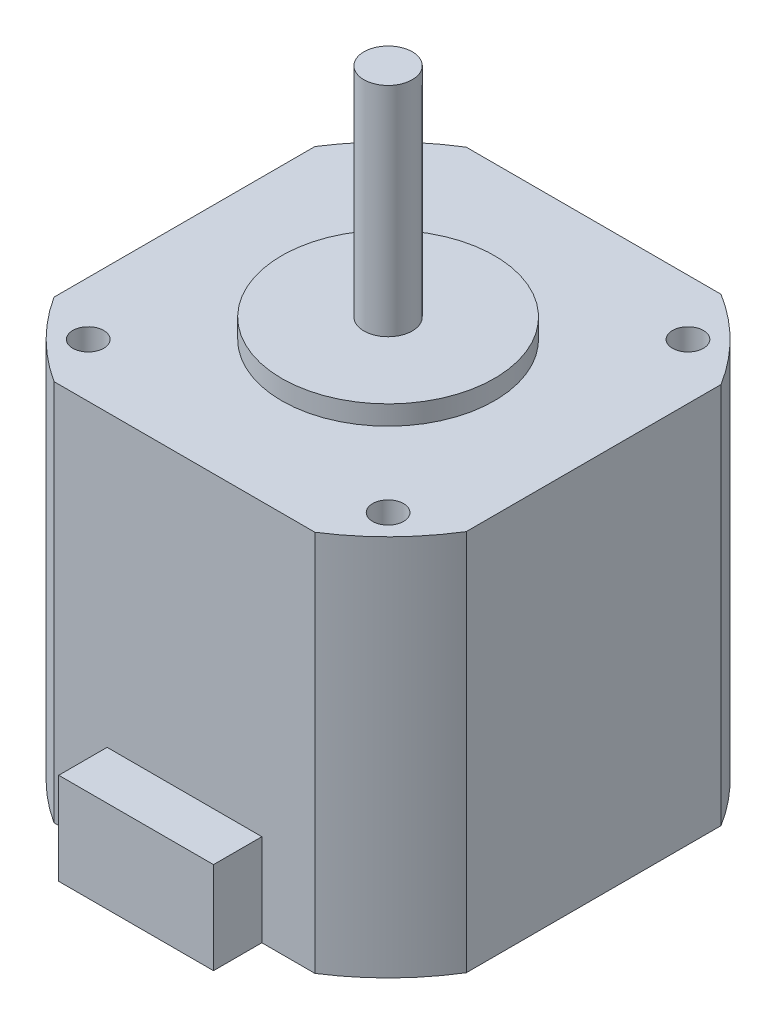
ISO-10303-21;
HEADER;
FILE_DESCRIPTION(('STEP AP214'),'2;1');
FILE_NAME('part.step','',(''),(''),'','','');
FILE_SCHEMA(('AUTOMOTIVE_DESIGN { 1 0 10303 214 1 1 1 1 }'));
ENDSEC;
DATA;
#1=APPLICATION_CONTEXT('core data for automotive mechanical design processes');
#2=APPLICATION_PROTOCOL_DEFINITION('international standard','automotive_design',2000,#1);
#3=PRODUCT_CONTEXT('',#1,'mechanical');
#4=PRODUCT('Part','Part','',(#3));
#5=PRODUCT_RELATED_PRODUCT_CATEGORY('part','',(#4));
#6=PRODUCT_DEFINITION_FORMATION('','',#4);
#7=PRODUCT_DEFINITION_CONTEXT('part definition',#1,'design');
#8=PRODUCT_DEFINITION('design','',#6,#7);
#9=PRODUCT_DEFINITION_SHAPE('','',#8);
#10=(LENGTH_UNIT() NAMED_UNIT(*) SI_UNIT(.MILLI.,.METRE.));
#11=(NAMED_UNIT(*) PLANE_ANGLE_UNIT() SI_UNIT($,.RADIAN.));
#12=(NAMED_UNIT(*) SI_UNIT($,.STERADIAN.) SOLID_ANGLE_UNIT());
#13=UNCERTAINTY_MEASURE_WITH_UNIT(LENGTH_MEASURE(1.E-05),#10,'distance_accuracy_value','');
#14=(GEOMETRIC_REPRESENTATION_CONTEXT(3) GLOBAL_UNCERTAINTY_ASSIGNED_CONTEXT((#13)) GLOBAL_UNIT_ASSIGNED_CONTEXT((#10,
#11,#12)) REPRESENTATION_CONTEXT('',''));
#15=CARTESIAN_POINT('',(0.,0.,0.));
#16=DIRECTION('',(0.,0.,1.));
#17=DIRECTION('',(1.,0.,0.));
#18=AXIS2_PLACEMENT_3D('',#15,#16,#17);
#19=CARTESIAN_POINT('',(0.,39.5,0.));
#20=DIRECTION('',(0.,0.,-1.));
#21=DIRECTION('',(-1.,0.,0.));
#22=AXIS2_PLACEMENT_3D('',#19,#20,#21);
#23=PLANE('',#22);
#24=DIRECTION('',(0.,-1.,0.));
#25=VECTOR('',#24,1.);
#26=CARTESIAN_POINT('',(13.05,9.5,0.));
#27=LINE('',#26,#25);
#28=CARTESIAN_POINT('',(13.05,9.5,0.));
#29=VERTEX_POINT('',#28);
#30=CARTESIAN_POINT('',(13.05,0.,0.));
#31=VERTEX_POINT('',#30);
#32=EDGE_CURVE('E252',#29,#31,#27,.T.);
#33=ORIENTED_EDGE('',*,*,#32,.F.);
#34=DIRECTION('',(-1.,0.,0.));
#35=VECTOR('',#34,1.);
#36=CARTESIAN_POINT('',(13.05,9.5,0.));
#37=LINE('',#36,#35);
#38=CARTESIAN_POINT('',(29.05,9.5,0.));
#39=VERTEX_POINT('',#38);
#40=EDGE_CURVE('E255',#39,#29,#37,.T.);
#41=ORIENTED_EDGE('',*,*,#40,.F.);
#42=DIRECTION('',(0.,-1.,0.));
#43=VECTOR('',#42,1.);
#44=CARTESIAN_POINT('',(29.05,9.5,0.));
#45=LINE('',#44,#43);
#46=CARTESIAN_POINT('',(29.05,0.,0.));
#47=VERTEX_POINT('',#46);
#48=EDGE_CURVE('E262',#39,#47,#45,.T.);
#49=ORIENTED_EDGE('',*,*,#48,.T.);
#50=DIRECTION('',(1.,0.,0.));
#51=VECTOR('',#50,1.);
#52=CARTESIAN_POINT('',(0.,0.,0.));
#53=LINE('',#52,#51);
#54=CARTESIAN_POINT('',(34.5369381254605,0.,0.));
#55=VERTEX_POINT('',#54);
#56=EDGE_CURVE('E169',#47,#55,#53,.T.);
#57=ORIENTED_EDGE('',*,*,#56,.T.);
#58=DIRECTION('',(0.,-1.,0.));
#59=VECTOR('',#58,1.);
#60=CARTESIAN_POINT('',(34.5369381254605,39.5,0.));
#61=LINE('',#60,#59);
#62=CARTESIAN_POINT('',(34.5369381254605,39.5,0.));
#63=VERTEX_POINT('',#62);
#64=EDGE_CURVE('E51',#63,#55,#61,.T.);
#65=ORIENTED_EDGE('',*,*,#64,.F.);
#66=DIRECTION('',(1.,0.,0.));
#67=VECTOR('',#66,1.);
#68=CARTESIAN_POINT('',(0.,39.5,0.));
#69=LINE('',#68,#67);
#70=CARTESIAN_POINT('',(7.5630618745395,39.5,0.));
#71=VERTEX_POINT('',#70);
#72=EDGE_CURVE('E211',#71,#63,#69,.T.);
#73=ORIENTED_EDGE('',*,*,#72,.F.);
#74=DIRECTION('',(0.,-1.,0.));
#75=VECTOR('',#74,1.);
#76=CARTESIAN_POINT('',(7.5630618745395,39.5,0.));
#77=LINE('',#76,#75);
#78=CARTESIAN_POINT('',(7.5630618745395,0.,0.));
#79=VERTEX_POINT('',#78);
#80=EDGE_CURVE('E160',#71,#79,#77,.T.);
#81=ORIENTED_EDGE('',*,*,#80,.T.);
#82=EDGE_CURVE('E164',#79,#31,#53,.T.);
#83=ORIENTED_EDGE('',*,*,#82,.T.);
#84=EDGE_LOOP('',(#33,#41,#49,#57,#65,#73,#81,#83));
#85=FACE_BOUND('',#84,.T.);
#86=ADVANCED_FACE('F48',(#85),#23,.F.);
#87=CARTESIAN_POINT('',(21.05,39.5,-21.05));
#88=DIRECTION('',(0.,-1.,0.));
#89=DIRECTION('',(0.,0.,-1.));
#90=AXIS2_PLACEMENT_3D('',#87,#88,#89);
#91=CYLINDRICAL_SURFACE('',#90,25.);
#92=CARTESIAN_POINT('',(21.05,0.,-21.05));
#93=DIRECTION('',(0.,1.,0.));
#94=DIRECTION('',(0.,0.,1.));
#95=AXIS2_PLACEMENT_3D('',#92,#93,#94);
#96=CIRCLE('',#95,25.);
#97=CARTESIAN_POINT('',(42.3,0.,-7.88043280893409));
#98=VERTEX_POINT('',#97);
#99=EDGE_CURVE('E168',#55,#98,#96,.T.);
#100=ORIENTED_EDGE('',*,*,#99,.T.);
#101=DIRECTION('',(0.,-1.,0.));
#102=VECTOR('',#101,1.);
#103=CARTESIAN_POINT('',(42.3,39.5,-7.88043280893409));
#104=LINE('',#103,#102);
#105=CARTESIAN_POINT('',(42.3,39.5,-7.88043280893409));
#106=VERTEX_POINT('',#105);
#107=EDGE_CURVE('E195',#106,#98,#104,.T.);
#108=ORIENTED_EDGE('',*,*,#107,.F.);
#109=CARTESIAN_POINT('',(21.05,39.5,-21.05));
#110=DIRECTION('',(0.,1.,0.));
#111=DIRECTION('',(0.,0.,1.));
#112=AXIS2_PLACEMENT_3D('',#109,#110,#111);
#113=CIRCLE('',#112,25.);
#114=EDGE_CURVE('E116',#63,#106,#113,.T.);
#115=ORIENTED_EDGE('',*,*,#114,.F.);
#116=ORIENTED_EDGE('',*,*,#64,.T.);
#117=EDGE_LOOP('',(#100,#108,#115,#116));
#118=FACE_BOUND('',#117,.T.);
#119=ADVANCED_FACE('F238',(#118),#91,.T.);
#120=CARTESIAN_POINT('',(42.3,39.5,0.));
#121=DIRECTION('',(-1.,0.,0.));
#122=DIRECTION('',(0.,0.,1.));
#123=AXIS2_PLACEMENT_3D('',#120,#121,#122);
#124=PLANE('',#123);
#125=DIRECTION('',(0.,0.,-1.));
#126=VECTOR('',#125,1.);
#127=CARTESIAN_POINT('',(42.3,0.,0.));
#128=LINE('',#127,#126);
#129=CARTESIAN_POINT('',(42.3,0.,-34.2195671910659));
#130=VERTEX_POINT('',#129);
#131=EDGE_CURVE('E172',#98,#130,#128,.T.);
#132=ORIENTED_EDGE('',*,*,#131,.T.);
#133=DIRECTION('',(0.,-1.,0.));
#134=VECTOR('',#133,1.);
#135=CARTESIAN_POINT('',(42.3,39.5,-34.2195671910659));
#136=LINE('',#135,#134);
#137=CARTESIAN_POINT('',(42.3,39.5,-34.2195671910659));
#138=VERTEX_POINT('',#137);
#139=EDGE_CURVE('E192',#138,#130,#136,.T.);
#140=ORIENTED_EDGE('',*,*,#139,.F.);
#141=DIRECTION('',(0.,0.,-1.));
#142=VECTOR('',#141,1.);
#143=CARTESIAN_POINT('',(42.3,39.5,0.));
#144=LINE('',#143,#142);
#145=EDGE_CURVE('E214',#106,#138,#144,.T.);
#146=ORIENTED_EDGE('',*,*,#145,.F.);
#147=ORIENTED_EDGE('',*,*,#107,.T.);
#148=EDGE_LOOP('',(#132,#140,#146,#147));
#149=FACE_BOUND('',#148,.T.);
#150=ADVANCED_FACE('F236',(#149),#124,.F.);
#151=CARTESIAN_POINT('',(34.2195671910659,0.,-42.3));
#152=VERTEX_POINT('',#151);
#153=EDGE_CURVE('E173',#130,#152,#96,.T.);
#154=ORIENTED_EDGE('',*,*,#153,.T.);
#155=DIRECTION('',(0.,-1.,0.));
#156=VECTOR('',#155,1.);
#157=CARTESIAN_POINT('',(34.2195671910659,39.5,-42.3));
#158=LINE('',#157,#156);
#159=CARTESIAN_POINT('',(34.2195671910659,39.5,-42.3));
#160=VERTEX_POINT('',#159);
#161=EDGE_CURVE('E189',#160,#152,#158,.T.);
#162=ORIENTED_EDGE('',*,*,#161,.F.);
#163=EDGE_CURVE('E143',#138,#160,#113,.T.);
#164=ORIENTED_EDGE('',*,*,#163,.F.);
#165=ORIENTED_EDGE('',*,*,#139,.T.);
#166=EDGE_LOOP('',(#154,#162,#164,#165));
#167=FACE_BOUND('',#166,.T.);
#168=ADVANCED_FACE('F233',(#167),#91,.T.);
#169=CARTESIAN_POINT('',(0.,39.5,-42.3));
#170=DIRECTION('',(0.,0.,-1.));
#171=DIRECTION('',(-1.,0.,0.));
#172=AXIS2_PLACEMENT_3D('',#169,#170,#171);
#173=PLANE('',#172);
#174=DIRECTION('',(1.,0.,0.));
#175=VECTOR('',#174,1.);
#176=CARTESIAN_POINT('',(0.,0.,-42.3));
#177=LINE('',#176,#175);
#178=CARTESIAN_POINT('',(7.88043280893409,0.,-42.3));
#179=VERTEX_POINT('',#178);
#180=EDGE_CURVE('E176',#179,#152,#177,.T.);
#181=ORIENTED_EDGE('',*,*,#180,.F.);
#182=DIRECTION('',(0.,-1.,0.));
#183=VECTOR('',#182,1.);
#184=CARTESIAN_POINT('',(7.88043280893409,39.5,-42.3));
#185=LINE('',#184,#183);
#186=CARTESIAN_POINT('',(7.88043280893409,39.5,-42.3));
#187=VERTEX_POINT('',#186);
#188=EDGE_CURVE('E153',#187,#179,#185,.T.);
#189=ORIENTED_EDGE('',*,*,#188,.F.);
#190=DIRECTION('',(1.,0.,0.));
#191=VECTOR('',#190,1.);
#192=CARTESIAN_POINT('',(0.,39.5,-42.3));
#193=LINE('',#192,#191);
#194=EDGE_CURVE('E139',#187,#160,#193,.T.);
#195=ORIENTED_EDGE('',*,*,#194,.T.);
#196=ORIENTED_EDGE('',*,*,#161,.T.);
#197=EDGE_LOOP('',(#181,#189,#195,#196));
#198=FACE_BOUND('',#197,.T.);
#199=ADVANCED_FACE('F223',(#198),#173,.T.);
#200=CARTESIAN_POINT('',(0.,0.,-34.5369381254605));
#201=VERTEX_POINT('',#200);
#202=EDGE_CURVE('E148',#179,#201,#96,.T.);
#203=ORIENTED_EDGE('',*,*,#202,.T.);
#204=DIRECTION('',(0.,-1.,0.));
#205=VECTOR('',#204,1.);
#206=CARTESIAN_POINT('',(0.,39.5,-34.5369381254605));
#207=LINE('',#206,#205);
#208=CARTESIAN_POINT('',(0.,39.5,-34.5369381254605));
#209=VERTEX_POINT('',#208);
#210=EDGE_CURVE('E145',#209,#201,#207,.T.);
#211=ORIENTED_EDGE('',*,*,#210,.F.);
#212=EDGE_CURVE('E133',#187,#209,#113,.T.);
#213=ORIENTED_EDGE('',*,*,#212,.F.);
#214=ORIENTED_EDGE('',*,*,#188,.T.);
#215=EDGE_LOOP('',(#203,#211,#213,#214));
#216=FACE_BOUND('',#215,.T.);
#217=ADVANCED_FACE('F146',(#216),#91,.T.);
#218=CARTESIAN_POINT('',(0.,39.5,0.));
#219=DIRECTION('',(-1.,0.,0.));
#220=DIRECTION('',(0.,0.,1.));
#221=AXIS2_PLACEMENT_3D('',#218,#219,#220);
#222=PLANE('',#221);
#223=DIRECTION('',(0.,0.,-1.));
#224=VECTOR('',#223,1.);
#225=CARTESIAN_POINT('',(0.,0.,0.));
#226=LINE('',#225,#224);
#227=CARTESIAN_POINT('',(0.,0.,-7.5630618745395));
#228=VERTEX_POINT('',#227);
#229=EDGE_CURVE('E180',#228,#201,#226,.T.);
#230=ORIENTED_EDGE('',*,*,#229,.F.);
#231=DIRECTION('',(0.,-1.,0.));
#232=VECTOR('',#231,1.);
#233=CARTESIAN_POINT('',(0.,39.5,-7.5630618745395));
#234=LINE('',#233,#232);
#235=CARTESIAN_POINT('',(0.,39.5,-7.5630618745395));
#236=VERTEX_POINT('',#235);
#237=EDGE_CURVE('E154',#236,#228,#234,.T.);
#238=ORIENTED_EDGE('',*,*,#237,.F.);
#239=DIRECTION('',(0.,0.,-1.));
#240=VECTOR('',#239,1.);
#241=CARTESIAN_POINT('',(0.,39.5,0.));
#242=LINE('',#241,#240);
#243=EDGE_CURVE('E137',#236,#209,#242,.T.);
#244=ORIENTED_EDGE('',*,*,#243,.T.);
#245=ORIENTED_EDGE('',*,*,#210,.T.);
#246=EDGE_LOOP('',(#230,#238,#244,#245));
#247=FACE_BOUND('',#246,.T.);
#248=ADVANCED_FACE('F156',(#247),#222,.T.);
#249=EDGE_CURVE('E107',#228,#79,#96,.T.);
#250=ORIENTED_EDGE('',*,*,#249,.T.);
#251=ORIENTED_EDGE('',*,*,#80,.F.);
#252=EDGE_CURVE('E74',#236,#71,#113,.T.);
#253=ORIENTED_EDGE('',*,*,#252,.F.);
#254=ORIENTED_EDGE('',*,*,#237,.T.);
#255=EDGE_LOOP('',(#250,#251,#253,#254));
#256=FACE_BOUND('',#255,.T.);
#257=ADVANCED_FACE('F243',(#256),#91,.T.);
#258=CARTESIAN_POINT('',(0.,39.5,0.));
#259=DIRECTION('',(0.,1.,0.));
#260=DIRECTION('',(0.,0.,1.));
#261=AXIS2_PLACEMENT_3D('',#258,#259,#260);
#262=PLANE('',#261);
#263=CARTESIAN_POINT('',(5.55,39.5,-5.55));
#264=DIRECTION('',(0.,1.,0.));
#265=DIRECTION('',(0.,0.,-1.));
#266=AXIS2_PLACEMENT_3D('',#263,#264,#265);
#267=CIRCLE('',#266,1.6);
#268=CARTESIAN_POINT('',(5.55,39.5,-7.14999999999999));
#269=VERTEX_POINT('',#268);
#270=EDGE_CURVE('E327',#269,#269,#267,.T.);
#271=ORIENTED_EDGE('',*,*,#270,.F.);
#272=EDGE_LOOP('',(#271));
#273=FACE_BOUND('',#272,.T.);
#274=CARTESIAN_POINT('',(36.55,39.5,-5.55));
#275=DIRECTION('',(0.,1.,0.));
#276=DIRECTION('',(0.,0.,1.));
#277=AXIS2_PLACEMENT_3D('',#274,#275,#276);
#278=CIRCLE('',#277,1.6);
#279=CARTESIAN_POINT('',(36.55,39.5,-3.95000000000001));
#280=VERTEX_POINT('',#279);
#281=EDGE_CURVE('E335',#280,#280,#278,.T.);
#282=ORIENTED_EDGE('',*,*,#281,.F.);
#283=EDGE_LOOP('',(#282));
#284=FACE_BOUND('',#283,.T.);
#285=CARTESIAN_POINT('',(36.55,39.5,-36.55));
#286=DIRECTION('',(0.,1.,0.));
#287=DIRECTION('',(0.,0.,-1.));
#288=AXIS2_PLACEMENT_3D('',#285,#286,#287);
#289=CIRCLE('',#288,1.6);
#290=CARTESIAN_POINT('',(36.55,39.5,-38.15));
#291=VERTEX_POINT('',#290);
#292=EDGE_CURVE('E319',#291,#291,#289,.T.);
#293=ORIENTED_EDGE('',*,*,#292,.F.);
#294=EDGE_LOOP('',(#293));
#295=FACE_BOUND('',#294,.T.);
#296=CARTESIAN_POINT('',(5.55,39.5,-36.55));
#297=DIRECTION('',(0.,1.,0.));
#298=DIRECTION('',(0.,0.,1.));
#299=AXIS2_PLACEMENT_3D('',#296,#297,#298);
#300=CIRCLE('',#299,1.6);
#301=CARTESIAN_POINT('',(5.55,39.5,-34.95));
#302=VERTEX_POINT('',#301);
#303=EDGE_CURVE('E315',#302,#302,#300,.T.);
#304=ORIENTED_EDGE('',*,*,#303,.F.);
#305=EDGE_LOOP('',(#304));
#306=FACE_BOUND('',#305,.T.);
#307=CARTESIAN_POINT('',(21.0500000000451,39.5,-21.0500000000451));
#308=DIRECTION('',(0.,1.,0.));
#309=DIRECTION('',(0.,0.,1.));
#310=AXIS2_PLACEMENT_3D('',#307,#308,#309);
#311=CIRCLE('',#310,11.);
#312=CARTESIAN_POINT('',(21.0500000000451,39.5,-10.0500000000451));
#313=VERTEX_POINT('',#312);
#314=EDGE_CURVE('E57',#313,#313,#311,.T.);
#315=ORIENTED_EDGE('',*,*,#314,.F.);
#316=EDGE_LOOP('',(#315));
#317=FACE_BOUND('',#316,.T.);
#318=ORIENTED_EDGE('',*,*,#72,.T.);
#319=ORIENTED_EDGE('',*,*,#114,.T.);
#320=ORIENTED_EDGE('',*,*,#145,.T.);
#321=ORIENTED_EDGE('',*,*,#163,.T.);
#322=ORIENTED_EDGE('',*,*,#194,.F.);
#323=ORIENTED_EDGE('',*,*,#212,.T.);
#324=ORIENTED_EDGE('',*,*,#243,.F.);
#325=ORIENTED_EDGE('',*,*,#252,.T.);
#326=EDGE_LOOP('',(#318,#319,#320,#321,#322,#323,#324,#325));
#327=FACE_BOUND('',#326,.T.);
#328=ADVANCED_FACE('F135',(#273,#284,#295,#306,#317,#327),#262,.T.);
#329=CARTESIAN_POINT('',(0.,0.,0.));
#330=DIRECTION('',(0.,1.,0.));
#331=DIRECTION('',(0.,0.,1.));
#332=AXIS2_PLACEMENT_3D('',#329,#330,#331);
#333=PLANE('',#332);
#334=ORIENTED_EDGE('',*,*,#82,.F.);
#335=ORIENTED_EDGE('',*,*,#249,.F.);
#336=ORIENTED_EDGE('',*,*,#229,.T.);
#337=ORIENTED_EDGE('',*,*,#202,.F.);
#338=ORIENTED_EDGE('',*,*,#180,.T.);
#339=ORIENTED_EDGE('',*,*,#153,.F.);
#340=ORIENTED_EDGE('',*,*,#131,.F.);
#341=ORIENTED_EDGE('',*,*,#99,.F.);
#342=ORIENTED_EDGE('',*,*,#56,.F.);
#343=DIRECTION('',(0.,0.,-1.));
#344=VECTOR('',#343,1.);
#345=CARTESIAN_POINT('',(29.05,0.,0.));
#346=LINE('',#345,#344);
#347=CARTESIAN_POINT('',(29.05,0.,5.));
#348=VERTEX_POINT('',#347);
#349=EDGE_CURVE('E65',#348,#47,#346,.T.);
#350=ORIENTED_EDGE('',*,*,#349,.F.);
#351=DIRECTION('',(1.,0.,0.));
#352=VECTOR('',#351,1.);
#353=CARTESIAN_POINT('',(13.05,0.,5.));
#354=LINE('',#353,#352);
#355=CARTESIAN_POINT('',(13.05,0.,5.));
#356=VERTEX_POINT('',#355);
#357=EDGE_CURVE('E294',#356,#348,#354,.T.);
#358=ORIENTED_EDGE('',*,*,#357,.F.);
#359=DIRECTION('',(0.,0.,1.));
#360=VECTOR('',#359,1.);
#361=CARTESIAN_POINT('',(13.05,0.,0.));
#362=LINE('',#361,#360);
#363=EDGE_CURVE('E302',#31,#356,#362,.T.);
#364=ORIENTED_EDGE('',*,*,#363,.F.);
#365=EDGE_LOOP('',(#334,#335,#336,#337,#338,#339,#340,#341,#342,#350,#358,#364));
#366=FACE_BOUND('',#365,.T.);
#367=ADVANCED_FACE('F227',(#366),#333,.F.);
#368=CARTESIAN_POINT('',(21.0500000000451,41.5,-21.0500000000451));
#369=DIRECTION('',(0.,-1.,0.));
#370=DIRECTION('',(0.,0.,-1.));
#371=AXIS2_PLACEMENT_3D('',#368,#369,#370);
#372=CYLINDRICAL_SURFACE('',#371,11.);
#373=CARTESIAN_POINT('',(21.0500000000451,41.5,-21.0500000000451));
#374=DIRECTION('',(0.,1.,0.));
#375=DIRECTION('',(0.,0.,1.));
#376=AXIS2_PLACEMENT_3D('',#373,#374,#375);
#377=CIRCLE('',#376,11.);
#378=CARTESIAN_POINT('',(21.0500000000451,41.5,-10.0500000000451));
#379=VERTEX_POINT('',#378);
#380=EDGE_CURVE('E210',#379,#379,#377,.T.);
#381=ORIENTED_EDGE('',*,*,#380,.F.);
#382=EDGE_LOOP('',(#381));
#383=FACE_BOUND('',#382,.T.);
#384=ORIENTED_EDGE('',*,*,#314,.T.);
#385=EDGE_LOOP('',(#384));
#386=FACE_BOUND('',#385,.T.);
#387=ADVANCED_FACE('F392',(#383,#386),#372,.T.);
#388=CARTESIAN_POINT('',(21.0500000000451,41.5,-21.0500000000451));
#389=DIRECTION('',(0.,1.,0.));
#390=DIRECTION('',(0.,0.,1.));
#391=AXIS2_PLACEMENT_3D('',#388,#389,#390);
#392=PLANE('',#391);
#393=CARTESIAN_POINT('',(21.0500000000451,41.5,-21.0500000000451));
#394=DIRECTION('',(0.,1.,0.));
#395=DIRECTION('',(0.,0.,1.));
#396=AXIS2_PLACEMENT_3D('',#393,#394,#395);
#397=CIRCLE('',#396,2.5);
#398=CARTESIAN_POINT('',(21.0500000000451,41.5,-23.5500000000451));
#399=VERTEX_POINT('',#398);
#400=EDGE_CURVE('E11',#399,#399,#397,.T.);
#401=ORIENTED_EDGE('',*,*,#400,.F.);
#402=EDGE_LOOP('',(#401));
#403=FACE_BOUND('',#402,.T.);
#404=ORIENTED_EDGE('',*,*,#380,.T.);
#405=EDGE_LOOP('',(#404));
#406=FACE_BOUND('',#405,.T.);
#407=ADVANCED_FACE('F388',(#403,#406),#392,.T.);
#408=CARTESIAN_POINT('',(21.0500000000451,64.,-21.0500000000451));
#409=DIRECTION('',(0.,-1.,0.));
#410=DIRECTION('',(0.,0.,-1.));
#411=AXIS2_PLACEMENT_3D('',#408,#409,#410);
#412=CYLINDRICAL_SURFACE('',#411,2.5);
#413=CARTESIAN_POINT('',(21.0500000000451,64.,-21.0500000000451));
#414=DIRECTION('',(0.,1.,0.));
#415=DIRECTION('',(0.,0.,1.));
#416=AXIS2_PLACEMENT_3D('',#413,#414,#415);
#417=CIRCLE('',#416,2.5);
#418=CARTESIAN_POINT('',(21.0500000000451,64.,-23.5500000000451));
#419=VERTEX_POINT('',#418);
#420=EDGE_CURVE('E279',#419,#419,#417,.T.);
#421=CARTESIAN_POINT('',(21.0500000000451,64.,-23.5500000000451));
#422=CARTESIAN_POINT('',(21.0500000000451,63.765625,-23.5500000000451));
#423=CARTESIAN_POINT('',(21.0500000000451,63.53125,-23.5500000000451));
#424=CARTESIAN_POINT('',(21.0500000000451,63.0625,-23.5500000000451));
#425=CARTESIAN_POINT('',(21.0500000000451,62.828125,-23.5500000000451));
#426=CARTESIAN_POINT('',(21.0500000000451,62.359375,-23.5500000000451));
#427=CARTESIAN_POINT('',(21.0500000000451,62.125,-23.5500000000451));
#428=CARTESIAN_POINT('',(21.0500000000451,61.65625,-23.5500000000451));
#429=CARTESIAN_POINT('',(21.0500000000451,61.421875,-23.5500000000451));
#430=CARTESIAN_POINT('',(21.0500000000451,60.953125,-23.5500000000451));
#431=CARTESIAN_POINT('',(21.0500000000451,60.71875,-23.5500000000451));
#432=CARTESIAN_POINT('',(21.0500000000451,60.25,-23.5500000000451));
#433=CARTESIAN_POINT('',(21.0500000000451,60.015625,-23.5500000000451));
#434=CARTESIAN_POINT('',(21.0500000000451,59.546875,-23.5500000000451));
#435=CARTESIAN_POINT('',(21.0500000000451,59.3125,-23.5500000000451));
#436=CARTESIAN_POINT('',(21.0500000000451,58.84375,-23.5500000000451));
#437=CARTESIAN_POINT('',(21.0500000000451,58.609375,-23.5500000000451));
#438=CARTESIAN_POINT('',(21.0500000000451,58.140625,-23.5500000000451));
#439=CARTESIAN_POINT('',(21.0500000000451,57.90625,-23.5500000000451));
#440=CARTESIAN_POINT('',(21.0500000000451,57.4375,-23.5500000000451));
#441=CARTESIAN_POINT('',(21.0500000000451,57.203125,-23.5500000000451));
#442=CARTESIAN_POINT('',(21.0500000000451,56.734375,-23.5500000000451));
#443=CARTESIAN_POINT('',(21.0500000000451,56.5,-23.5500000000451));
#444=CARTESIAN_POINT('',(21.0500000000451,56.03125,-23.5500000000451));
#445=CARTESIAN_POINT('',(21.0500000000451,55.796875,-23.5500000000451));
#446=CARTESIAN_POINT('',(21.0500000000451,55.328125,-23.5500000000451));
#447=CARTESIAN_POINT('',(21.0500000000451,55.09375,-23.5500000000451));
#448=CARTESIAN_POINT('',(21.0500000000451,54.625,-23.5500000000451));
#449=CARTESIAN_POINT('',(21.0500000000451,54.390625,-23.5500000000451));
#450=CARTESIAN_POINT('',(21.0500000000451,53.921875,-23.5500000000451));
#451=CARTESIAN_POINT('',(21.0500000000451,53.6875,-23.5500000000451));
#452=CARTESIAN_POINT('',(21.0500000000451,53.21875,-23.5500000000451));
#453=CARTESIAN_POINT('',(21.0500000000451,52.984375,-23.5500000000451));
#454=CARTESIAN_POINT('',(21.0500000000451,52.515625,-23.5500000000451));
#455=CARTESIAN_POINT('',(21.0500000000451,52.28125,-23.5500000000451));
#456=CARTESIAN_POINT('',(21.0500000000451,51.8125,-23.5500000000451));
#457=CARTESIAN_POINT('',(21.0500000000451,51.578125,-23.5500000000451));
#458=CARTESIAN_POINT('',(21.0500000000451,51.109375,-23.5500000000451));
#459=CARTESIAN_POINT('',(21.0500000000451,50.875,-23.5500000000451));
#460=CARTESIAN_POINT('',(21.0500000000451,50.40625,-23.5500000000451));
#461=CARTESIAN_POINT('',(21.0500000000451,50.171875,-23.5500000000451));
#462=CARTESIAN_POINT('',(21.0500000000451,49.703125,-23.5500000000451));
#463=CARTESIAN_POINT('',(21.0500000000451,49.46875,-23.5500000000451));
#464=CARTESIAN_POINT('',(21.0500000000451,49.,-23.5500000000451));
#465=CARTESIAN_POINT('',(21.0500000000451,48.765625,-23.5500000000451));
#466=CARTESIAN_POINT('',(21.0500000000451,48.296875,-23.5500000000451));
#467=CARTESIAN_POINT('',(21.0500000000451,48.0625,-23.5500000000451));
#468=CARTESIAN_POINT('',(21.0500000000451,47.59375,-23.5500000000451));
#469=CARTESIAN_POINT('',(21.0500000000451,47.359375,-23.5500000000451));
#470=CARTESIAN_POINT('',(21.0500000000451,46.890625,-23.5500000000451));
#471=CARTESIAN_POINT('',(21.0500000000451,46.65625,-23.5500000000451));
#472=CARTESIAN_POINT('',(21.0500000000451,46.1875,-23.5500000000451));
#473=CARTESIAN_POINT('',(21.0500000000451,45.953125,-23.5500000000451));
#474=CARTESIAN_POINT('',(21.0500000000451,45.484375,-23.5500000000451));
#475=CARTESIAN_POINT('',(21.0500000000451,45.25,-23.5500000000451));
#476=CARTESIAN_POINT('',(21.0500000000451,44.78125,-23.5500000000451));
#477=CARTESIAN_POINT('',(21.0500000000451,44.546875,-23.5500000000451));
#478=CARTESIAN_POINT('',(21.0500000000451,44.078125,-23.5500000000451));
#479=CARTESIAN_POINT('',(21.0500000000451,43.84375,-23.5500000000451));
#480=CARTESIAN_POINT('',(21.0500000000451,43.375,-23.5500000000451));
#481=CARTESIAN_POINT('',(21.0500000000451,43.140625,-23.5500000000451));
#482=CARTESIAN_POINT('',(21.0500000000451,42.671875,-23.5500000000451));
#483=CARTESIAN_POINT('',(21.0500000000451,42.4375,-23.5500000000451));
#484=CARTESIAN_POINT('',(21.0500000000451,41.96875,-23.5500000000451));
#485=CARTESIAN_POINT('',(21.0500000000451,41.734375,-23.5500000000451));
#486=CARTESIAN_POINT('',(21.0500000000451,41.5,-23.5500000000451));
#487=B_SPLINE_CURVE_WITH_KNOTS('',3,(#421,#422,#423,#424,#425,#426,#427,#428,#429,#430,#431,
#432,#433,#434,#435,#436,#437,#438,#439,#440,#441,#442,#443,#444,#445,#446,#447,#448,#449,#450,
#451,#452,#453,#454,#455,#456,#457,#458,#459,#460,#461,#462,#463,#464,#465,#466,#467,#468,#469,
#470,#471,#472,#473,#474,#475,#476,#477,#478,#479,#480,#481,#482,#483,#484,#485,#486),
.UNSPECIFIED.,.F.,.F.,(4,2,2,2,2,2,2,2,2,2,2,2,2,2,2,2,2,2,2,2,2,2,2,2,2,2,2,2,2,2,2,2,4),(0.,
0.703125000000013,1.40625000000001,2.109375,2.81250000000001,3.51562500000001,4.21875000000001,
4.92187500000001,5.62500000000001,6.328125,7.03125,7.73437500000001,8.43750000000001,
9.14062500000001,9.84375000000001,10.546875,11.25,11.953125,12.65625,13.359375,14.0625,
14.765625,15.46875,16.171875,16.875,17.578125,18.28125,18.984375,19.6875,20.390625,21.09375,
21.796875,22.5),.UNSPECIFIED.);
#488=EDGE_CURVE('BSEAM385',#419,#399,#487,.T.);
#489=ORIENTED_EDGE('',*,*,#420,.F.);
#490=ORIENTED_EDGE('',*,*,#400,.T.);
#491=ORIENTED_EDGE('',*,*,#488,.T.);
#492=ORIENTED_EDGE('',*,*,#488,.F.);
#493=EDGE_LOOP('',(#489,#491,#490,#492));
#494=FACE_BOUND('',#493,.T.);
#495=ADVANCED_FACE('F385',(#494),#412,.T.);
#496=CARTESIAN_POINT('',(21.0500000000451,64.,-21.0500000000451));
#497=DIRECTION('',(0.,1.,0.));
#498=DIRECTION('',(0.,0.,1.));
#499=AXIS2_PLACEMENT_3D('',#496,#497,#498);
#500=PLANE('',#499);
#501=ORIENTED_EDGE('',*,*,#420,.T.);
#502=EDGE_LOOP('',(#501));
#503=FACE_BOUND('',#502,.T.);
#504=ADVANCED_FACE('F382',(#503),#500,.T.);
#505=CARTESIAN_POINT('',(13.05,9.5,0.));
#506=DIRECTION('',(1.,0.,0.));
#507=DIRECTION('',(0.,0.,-1.));
#508=AXIS2_PLACEMENT_3D('',#505,#506,#507);
#509=PLANE('',#508);
#510=ORIENTED_EDGE('',*,*,#363,.T.);
#511=DIRECTION('',(0.,-1.,0.));
#512=VECTOR('',#511,1.);
#513=CARTESIAN_POINT('',(13.05,9.5,5.));
#514=LINE('',#513,#512);
#515=CARTESIAN_POINT('',(13.05,9.5,5.));
#516=VERTEX_POINT('',#515);
#517=EDGE_CURVE('E275',#516,#356,#514,.T.);
#518=ORIENTED_EDGE('',*,*,#517,.F.);
#519=DIRECTION('',(0.,0.,1.));
#520=VECTOR('',#519,1.);
#521=CARTESIAN_POINT('',(13.05,9.5,0.));
#522=LINE('',#521,#520);
#523=EDGE_CURVE('E296',#29,#516,#522,.T.);
#524=ORIENTED_EDGE('',*,*,#523,.F.);
#525=ORIENTED_EDGE('',*,*,#32,.T.);
#526=EDGE_LOOP('',(#510,#518,#524,#525));
#527=FACE_BOUND('',#526,.T.);
#528=ADVANCED_FACE('F379',(#527),#509,.F.);
#529=CARTESIAN_POINT('',(13.05,9.5,5.));
#530=DIRECTION('',(0.,0.,-1.));
#531=DIRECTION('',(-1.,0.,0.));
#532=AXIS2_PLACEMENT_3D('',#529,#530,#531);
#533=PLANE('',#532);
#534=ORIENTED_EDGE('',*,*,#357,.T.);
#535=DIRECTION('',(0.,-1.,0.));
#536=VECTOR('',#535,1.);
#537=CARTESIAN_POINT('',(29.05,9.5,5.));
#538=LINE('',#537,#536);
#539=CARTESIAN_POINT('',(29.05,9.5,5.));
#540=VERTEX_POINT('',#539);
#541=EDGE_CURVE('E266',#540,#348,#538,.T.);
#542=ORIENTED_EDGE('',*,*,#541,.F.);
#543=DIRECTION('',(1.,0.,0.));
#544=VECTOR('',#543,1.);
#545=CARTESIAN_POINT('',(13.05,9.5,5.));
#546=LINE('',#545,#544);
#547=EDGE_CURVE('E300',#516,#540,#546,.T.);
#548=ORIENTED_EDGE('',*,*,#547,.F.);
#549=ORIENTED_EDGE('',*,*,#517,.T.);
#550=EDGE_LOOP('',(#534,#542,#548,#549));
#551=FACE_BOUND('',#550,.T.);
#552=ADVANCED_FACE('F376',(#551),#533,.F.);
#553=CARTESIAN_POINT('',(29.05,9.5,0.));
#554=DIRECTION('',(-1.,0.,0.));
#555=DIRECTION('',(0.,0.,1.));
#556=AXIS2_PLACEMENT_3D('',#553,#554,#555);
#557=PLANE('',#556);
#558=ORIENTED_EDGE('',*,*,#349,.T.);
#559=ORIENTED_EDGE('',*,*,#48,.F.);
#560=DIRECTION('',(0.,0.,-1.));
#561=VECTOR('',#560,1.);
#562=CARTESIAN_POINT('',(29.05,9.5,0.));
#563=LINE('',#562,#561);
#564=EDGE_CURVE('E268',#540,#39,#563,.T.);
#565=ORIENTED_EDGE('',*,*,#564,.F.);
#566=ORIENTED_EDGE('',*,*,#541,.T.);
#567=EDGE_LOOP('',(#558,#559,#565,#566));
#568=FACE_BOUND('',#567,.T.);
#569=ADVANCED_FACE('F368',(#568),#557,.F.);
#570=CARTESIAN_POINT('',(0.,9.5,0.));
#571=DIRECTION('',(0.,1.,0.));
#572=DIRECTION('',(0.,0.,1.));
#573=AXIS2_PLACEMENT_3D('',#570,#571,#572);
#574=PLANE('',#573);
#575=ORIENTED_EDGE('',*,*,#523,.T.);
#576=ORIENTED_EDGE('',*,*,#547,.T.);
#577=ORIENTED_EDGE('',*,*,#564,.T.);
#578=ORIENTED_EDGE('',*,*,#40,.T.);
#579=EDGE_LOOP('',(#575,#576,#577,#578));
#580=FACE_BOUND('',#579,.T.);
#581=ADVANCED_FACE('F358',(#580),#574,.T.);
#582=CARTESIAN_POINT('',(5.55,34.5,-36.55));
#583=DIRECTION('',(0.,1.,0.));
#584=DIRECTION('',(0.,0.,1.));
#585=AXIS2_PLACEMENT_3D('',#582,#583,#584);
#586=CYLINDRICAL_SURFACE('',#585,1.6);
#587=CARTESIAN_POINT('',(5.55,34.5,-36.55));
#588=DIRECTION('',(0.,1.,0.));
#589=DIRECTION('',(0.,0.,1.));
#590=AXIS2_PLACEMENT_3D('',#587,#588,#589);
#591=CIRCLE('',#590,1.6);
#592=CARTESIAN_POINT('',(5.55,34.5,-34.95));
#593=VERTEX_POINT('',#592);
#594=EDGE_CURVE('E306',#593,#593,#591,.T.);
#595=ORIENTED_EDGE('',*,*,#594,.F.);
#596=EDGE_LOOP('',(#595));
#597=FACE_BOUND('',#596,.T.);
#598=ORIENTED_EDGE('',*,*,#303,.T.);
#599=EDGE_LOOP('',(#598));
#600=FACE_BOUND('',#599,.T.);
#601=ADVANCED_FACE('F355',(#597,#600),#586,.F.);
#602=CARTESIAN_POINT('',(5.55,34.5,-36.55));
#603=DIRECTION('',(0.,1.,0.));
#604=DIRECTION('',(0.,0.,1.));
#605=AXIS2_PLACEMENT_3D('',#602,#603,#604);
#606=PLANE('',#605);
#607=ORIENTED_EDGE('',*,*,#594,.T.);
#608=EDGE_LOOP('',(#607));
#609=FACE_BOUND('',#608,.T.);
#610=ADVANCED_FACE('F357',(#609),#606,.T.);
#611=CARTESIAN_POINT('',(36.55,34.5,-36.55));
#612=DIRECTION('',(0.,1.,0.));
#613=DIRECTION('',(0.,0.,1.));
#614=AXIS2_PLACEMENT_3D('',#611,#612,#613);
#615=CYLINDRICAL_SURFACE('',#614,1.6);
#616=CARTESIAN_POINT('',(36.55,34.5,-36.55));
#617=DIRECTION('',(0.,1.,0.));
#618=DIRECTION('',(0.,0.,-1.));
#619=AXIS2_PLACEMENT_3D('',#616,#617,#618);
#620=CIRCLE('',#619,1.6);
#621=CARTESIAN_POINT('',(36.55,34.5,-38.15));
#622=VERTEX_POINT('',#621);
#623=EDGE_CURVE('E339',#622,#622,#620,.T.);
#624=ORIENTED_EDGE('',*,*,#623,.F.);
#625=EDGE_LOOP('',(#624));
#626=FACE_BOUND('',#625,.T.);
#627=ORIENTED_EDGE('',*,*,#292,.T.);
#628=EDGE_LOOP('',(#627));
#629=FACE_BOUND('',#628,.T.);
#630=ADVANCED_FACE('F347',(#626,#629),#615,.F.);
#631=CARTESIAN_POINT('',(36.55,34.5,-36.55));
#632=DIRECTION('',(0.,-1.,0.));
#633=DIRECTION('',(0.,0.,-1.));
#634=AXIS2_PLACEMENT_3D('',#631,#632,#633);
#635=PLANE('',#634);
#636=ORIENTED_EDGE('',*,*,#623,.T.);
#637=EDGE_LOOP('',(#636));
#638=FACE_BOUND('',#637,.T.);
#639=ADVANCED_FACE('F534',(#638),#635,.F.);
#640=CARTESIAN_POINT('',(36.55,34.5,-5.55));
#641=DIRECTION('',(0.,1.,0.));
#642=DIRECTION('',(0.,0.,1.));
#643=AXIS2_PLACEMENT_3D('',#640,#641,#642);
#644=CYLINDRICAL_SURFACE('',#643,1.6);
#645=CARTESIAN_POINT('',(36.55,34.5,-5.55));
#646=DIRECTION('',(0.,1.,0.));
#647=DIRECTION('',(0.,0.,1.));
#648=AXIS2_PLACEMENT_3D('',#645,#646,#647);
#649=CIRCLE('',#648,1.6);
#650=CARTESIAN_POINT('',(36.55,34.5,-3.95000000000001));
#651=VERTEX_POINT('',#650);
#652=EDGE_CURVE('E331',#651,#651,#649,.T.);
#653=ORIENTED_EDGE('',*,*,#652,.F.);
#654=EDGE_LOOP('',(#653));
#655=FACE_BOUND('',#654,.T.);
#656=ORIENTED_EDGE('',*,*,#281,.T.);
#657=EDGE_LOOP('',(#656));
#658=FACE_BOUND('',#657,.T.);
#659=ADVANCED_FACE('F543',(#655,#658),#644,.F.);
#660=CARTESIAN_POINT('',(36.55,34.5,-5.55));
#661=DIRECTION('',(0.,1.,0.));
#662=DIRECTION('',(0.,0.,1.));
#663=AXIS2_PLACEMENT_3D('',#660,#661,#662);
#664=PLANE('',#663);
#665=ORIENTED_EDGE('',*,*,#652,.T.);
#666=EDGE_LOOP('',(#665));
#667=FACE_BOUND('',#666,.T.);
#668=ADVANCED_FACE('F552',(#667),#664,.T.);
#669=CARTESIAN_POINT('',(5.55,34.5,-5.55));
#670=DIRECTION('',(0.,1.,0.));
#671=DIRECTION('',(0.,0.,1.));
#672=AXIS2_PLACEMENT_3D('',#669,#670,#671);
#673=CYLINDRICAL_SURFACE('',#672,1.6);
#674=CARTESIAN_POINT('',(5.55,34.5,-5.55));
#675=DIRECTION('',(0.,1.,0.));
#676=DIRECTION('',(0.,0.,-1.));
#677=AXIS2_PLACEMENT_3D('',#674,#675,#676);
#678=CIRCLE('',#677,1.6);
#679=CARTESIAN_POINT('',(5.55,34.5,-7.14999999999999));
#680=VERTEX_POINT('',#679);
#681=EDGE_CURVE('E323',#680,#680,#678,.T.);
#682=ORIENTED_EDGE('',*,*,#681,.F.);
#683=EDGE_LOOP('',(#682));
#684=FACE_BOUND('',#683,.T.);
#685=ORIENTED_EDGE('',*,*,#270,.T.);
#686=EDGE_LOOP('',(#685));
#687=FACE_BOUND('',#686,.T.);
#688=ADVANCED_FACE('F561',(#684,#687),#673,.F.);
#689=CARTESIAN_POINT('',(5.55,34.5,-5.55));
#690=DIRECTION('',(0.,-1.,0.));
#691=DIRECTION('',(0.,0.,-1.));
#692=AXIS2_PLACEMENT_3D('',#689,#690,#691);
#693=PLANE('',#692);
#694=ORIENTED_EDGE('',*,*,#681,.T.);
#695=EDGE_LOOP('',(#694));
#696=FACE_BOUND('',#695,.T.);
#697=ADVANCED_FACE('F570',(#696),#693,.F.);
#698=CLOSED_SHELL('',(#86,#119,#150,#168,#199,#217,#248,#257,#328,#367,#387,#407,#495,#504,#528,
#552,#569,#581,#601,#610,#630,#639,#659,#668,#688,#697));
#699=MANIFOLD_SOLID_BREP('B2',#698);
#700=ADVANCED_BREP_SHAPE_REPRESENTATION('',(#18,#699),#14);
#701=SHAPE_DEFINITION_REPRESENTATION(#9,#700);
ENDSEC;
END-ISO-10303-21;
